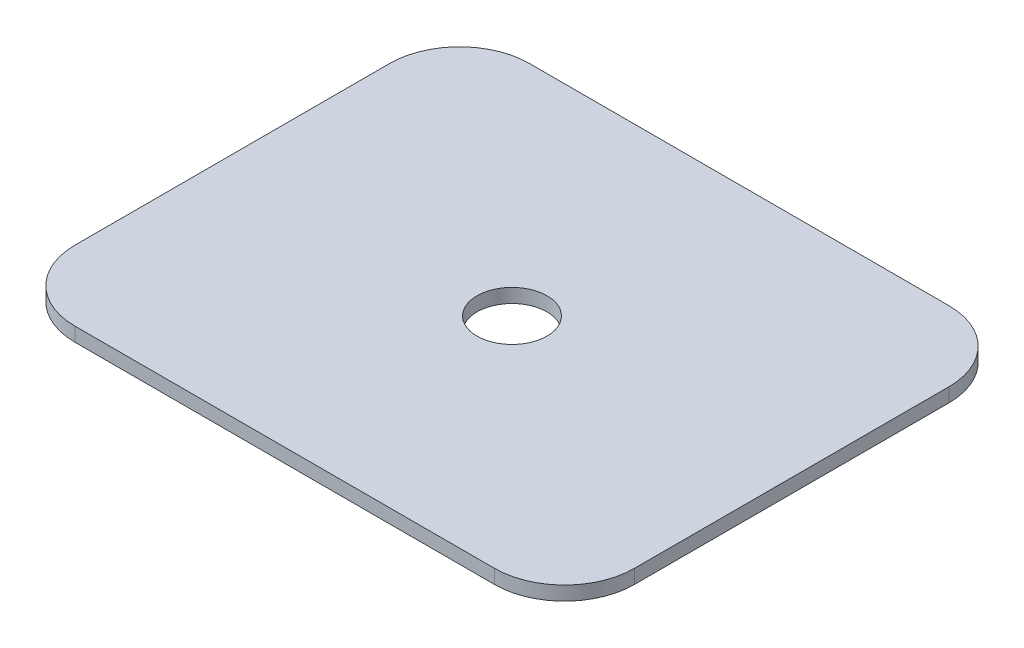
ISO-10303-21;
HEADER;
FILE_DESCRIPTION(('STEP AP214'),'2;1');
FILE_NAME('part.step','',(''),(''),'','','');
FILE_SCHEMA(('AUTOMOTIVE_DESIGN { 1 0 10303 214 1 1 1 1 }'));
ENDSEC;
DATA;
#1=APPLICATION_CONTEXT('core data for automotive mechanical design processes');
#2=APPLICATION_PROTOCOL_DEFINITION('international standard','automotive_design',2000,#1);
#3=PRODUCT_CONTEXT('',#1,'mechanical');
#4=PRODUCT('Part','Part','',(#3));
#5=PRODUCT_RELATED_PRODUCT_CATEGORY('part','',(#4));
#6=PRODUCT_DEFINITION_FORMATION('','',#4);
#7=PRODUCT_DEFINITION_CONTEXT('part definition',#1,'design');
#8=PRODUCT_DEFINITION('design','',#6,#7);
#9=PRODUCT_DEFINITION_SHAPE('','',#8);
#10=(LENGTH_UNIT() NAMED_UNIT(*) SI_UNIT(.MILLI.,.METRE.));
#11=(NAMED_UNIT(*) PLANE_ANGLE_UNIT() SI_UNIT($,.RADIAN.));
#12=(NAMED_UNIT(*) SI_UNIT($,.STERADIAN.) SOLID_ANGLE_UNIT());
#13=UNCERTAINTY_MEASURE_WITH_UNIT(LENGTH_MEASURE(1.E-05),#10,'distance_accuracy_value','');
#14=(GEOMETRIC_REPRESENTATION_CONTEXT(3) GLOBAL_UNCERTAINTY_ASSIGNED_CONTEXT((#13)) GLOBAL_UNIT_ASSIGNED_CONTEXT((#10,
#11,#12)) REPRESENTATION_CONTEXT('',''));
#15=CARTESIAN_POINT('',(0.,0.,0.));
#16=DIRECTION('',(0.,0.,1.));
#17=DIRECTION('',(1.,0.,0.));
#18=AXIS2_PLACEMENT_3D('',#15,#16,#17);
#19=CARTESIAN_POINT('',(-30.,2.,7.99999999999998));
#20=DIRECTION('',(0.,1.,0.));
#21=DIRECTION('',(0.,0.,1.));
#22=AXIS2_PLACEMENT_3D('',#19,#20,#21);
#23=PLANE('',#22);
#24=CARTESIAN_POINT('',(-30.,2.,7.99999999999998));
#25=DIRECTION('',(0.,1.,0.));
#26=DIRECTION('',(0.,0.,1.));
#27=AXIS2_PLACEMENT_3D('',#24,#25,#26);
#28=CIRCLE('',#27,10.);
#29=CARTESIAN_POINT('',(-30.,2.,-2.00000000000002));
#30=VERTEX_POINT('',#29);
#31=CARTESIAN_POINT('',(-40.,2.,8.00000000000006));
#32=VERTEX_POINT('',#31);
#33=EDGE_CURVE('E143',#30,#32,#28,.T.);
#34=ORIENTED_EDGE('',*,*,#33,.T.);
#35=DIRECTION('',(0.,0.,1.));
#36=VECTOR('',#35,1.);
#37=CARTESIAN_POINT('',(-40.,2.,8.00000000000006));
#38=LINE('',#37,#36);
#39=CARTESIAN_POINT('',(-40.,2.,52.9999999999999));
#40=VERTEX_POINT('',#39);
#41=EDGE_CURVE('E91',#32,#40,#38,.T.);
#42=ORIENTED_EDGE('',*,*,#41,.T.);
#43=CARTESIAN_POINT('',(-30.,2.,53.));
#44=DIRECTION('',(0.,1.,0.));
#45=DIRECTION('',(0.,0.,1.));
#46=AXIS2_PLACEMENT_3D('',#43,#44,#45);
#47=CIRCLE('',#46,10.);
#48=CARTESIAN_POINT('',(-30.,2.,63.));
#49=VERTEX_POINT('',#48);
#50=EDGE_CURVE('E158',#40,#49,#47,.T.);
#51=ORIENTED_EDGE('',*,*,#50,.T.);
#52=DIRECTION('',(1.,0.,0.));
#53=VECTOR('',#52,1.);
#54=CARTESIAN_POINT('',(-30.,2.,63.));
#55=LINE('',#54,#53);
#56=CARTESIAN_POINT('',(30.,2.,63.));
#57=VERTEX_POINT('',#56);
#58=EDGE_CURVE('E171',#49,#57,#55,.T.);
#59=ORIENTED_EDGE('',*,*,#58,.T.);
#60=CARTESIAN_POINT('',(30.,2.,53.));
#61=DIRECTION('',(0.,1.,0.));
#62=DIRECTION('',(0.,0.,1.));
#63=AXIS2_PLACEMENT_3D('',#60,#61,#62);
#64=CIRCLE('',#63,10.);
#65=CARTESIAN_POINT('',(40.,2.,52.9999999999999));
#66=VERTEX_POINT('',#65);
#67=EDGE_CURVE('E110',#57,#66,#64,.T.);
#68=ORIENTED_EDGE('',*,*,#67,.T.);
#69=DIRECTION('',(0.,0.,-1.));
#70=VECTOR('',#69,1.);
#71=CARTESIAN_POINT('',(40.,2.,8.00000000000006));
#72=LINE('',#71,#70);
#73=CARTESIAN_POINT('',(40.,2.,8.00000000000006));
#74=VERTEX_POINT('',#73);
#75=EDGE_CURVE('E104',#66,#74,#72,.T.);
#76=ORIENTED_EDGE('',*,*,#75,.T.);
#77=CARTESIAN_POINT('',(30.,2.,7.99999999999998));
#78=DIRECTION('',(0.,1.,0.));
#79=DIRECTION('',(0.,0.,1.));
#80=AXIS2_PLACEMENT_3D('',#77,#78,#79);
#81=CIRCLE('',#80,10.);
#82=CARTESIAN_POINT('',(30.,2.,-2.00000000000002));
#83=VERTEX_POINT('',#82);
#84=EDGE_CURVE('E108',#74,#83,#81,.T.);
#85=ORIENTED_EDGE('',*,*,#84,.T.);
#86=DIRECTION('',(-1.,0.,0.));
#87=VECTOR('',#86,1.);
#88=CARTESIAN_POINT('',(-30.,2.,-2.00000000000002));
#89=LINE('',#88,#87);
#90=EDGE_CURVE('E48',#83,#30,#89,.T.);
#91=ORIENTED_EDGE('',*,*,#90,.T.);
#92=EDGE_LOOP('',(#34,#42,#51,#59,#68,#76,#85,#91));
#93=FACE_BOUND('',#92,.T.);
#94=CARTESIAN_POINT('',(0.,2.,30.5));
#95=DIRECTION('',(0.,1.,0.));
#96=DIRECTION('',(0.,0.,1.));
#97=AXIS2_PLACEMENT_3D('',#94,#95,#96);
#98=CIRCLE('',#97,5.);
#99=CARTESIAN_POINT('',(0.,2.,35.5));
#100=VERTEX_POINT('',#99);
#101=EDGE_CURVE('E132',#100,#100,#98,.T.);
#102=ORIENTED_EDGE('',*,*,#101,.F.);
#103=EDGE_LOOP('',(#102));
#104=FACE_BOUND('',#103,.T.);
#105=ADVANCED_FACE('F31',(#93,#104),#23,.T.);
#106=CARTESIAN_POINT('',(-30.,0.,7.99999999999998));
#107=DIRECTION('',(0.,1.,0.));
#108=DIRECTION('',(0.,0.,1.));
#109=AXIS2_PLACEMENT_3D('',#106,#107,#108);
#110=PLANE('',#109);
#111=CARTESIAN_POINT('',(-30.,0.,7.99999999999998));
#112=DIRECTION('',(0.,1.,0.));
#113=DIRECTION('',(0.,0.,1.));
#114=AXIS2_PLACEMENT_3D('',#111,#112,#113);
#115=CIRCLE('',#114,10.);
#116=CARTESIAN_POINT('',(-30.,0.,-2.00000000000002));
#117=VERTEX_POINT('',#116);
#118=CARTESIAN_POINT('',(-40.,0.,8.00000000000006));
#119=VERTEX_POINT('',#118);
#120=EDGE_CURVE('E128',#117,#119,#115,.T.);
#121=ORIENTED_EDGE('',*,*,#120,.F.);
#122=DIRECTION('',(-1.,0.,0.));
#123=VECTOR('',#122,1.);
#124=CARTESIAN_POINT('',(-30.,0.,-2.00000000000002));
#125=LINE('',#124,#123);
#126=CARTESIAN_POINT('',(30.,0.,-2.00000000000002));
#127=VERTEX_POINT('',#126);
#128=EDGE_CURVE('E83',#127,#117,#125,.T.);
#129=ORIENTED_EDGE('',*,*,#128,.F.);
#130=CARTESIAN_POINT('',(30.,0.,7.99999999999998));
#131=DIRECTION('',(0.,1.,0.));
#132=DIRECTION('',(0.,0.,1.));
#133=AXIS2_PLACEMENT_3D('',#130,#131,#132);
#134=CIRCLE('',#133,10.);
#135=CARTESIAN_POINT('',(40.,0.,8.00000000000006));
#136=VERTEX_POINT('',#135);
#137=EDGE_CURVE('E77',#136,#127,#134,.T.);
#138=ORIENTED_EDGE('',*,*,#137,.F.);
#139=DIRECTION('',(0.,0.,-1.));
#140=VECTOR('',#139,1.);
#141=CARTESIAN_POINT('',(40.,0.,8.00000000000006));
#142=LINE('',#141,#140);
#143=CARTESIAN_POINT('',(40.,0.,52.9999999999999));
#144=VERTEX_POINT('',#143);
#145=EDGE_CURVE('E118',#144,#136,#142,.T.);
#146=ORIENTED_EDGE('',*,*,#145,.F.);
#147=CARTESIAN_POINT('',(30.,0.,53.));
#148=DIRECTION('',(0.,1.,0.));
#149=DIRECTION('',(0.,0.,1.));
#150=AXIS2_PLACEMENT_3D('',#147,#148,#149);
#151=CIRCLE('',#150,10.);
#152=CARTESIAN_POINT('',(30.,0.,63.));
#153=VERTEX_POINT('',#152);
#154=EDGE_CURVE('E138',#153,#144,#151,.T.);
#155=ORIENTED_EDGE('',*,*,#154,.F.);
#156=DIRECTION('',(1.,0.,0.));
#157=VECTOR('',#156,1.);
#158=CARTESIAN_POINT('',(-30.,0.,63.));
#159=LINE('',#158,#157);
#160=CARTESIAN_POINT('',(-30.,0.,63.));
#161=VERTEX_POINT('',#160);
#162=EDGE_CURVE('E136',#161,#153,#159,.T.);
#163=ORIENTED_EDGE('',*,*,#162,.F.);
#164=CARTESIAN_POINT('',(-30.,0.,53.));
#165=DIRECTION('',(0.,1.,0.));
#166=DIRECTION('',(0.,0.,1.));
#167=AXIS2_PLACEMENT_3D('',#164,#165,#166);
#168=CIRCLE('',#167,10.);
#169=CARTESIAN_POINT('',(-40.,0.,52.9999999999999));
#170=VERTEX_POINT('',#169);
#171=EDGE_CURVE('E134',#170,#161,#168,.T.);
#172=ORIENTED_EDGE('',*,*,#171,.F.);
#173=DIRECTION('',(0.,0.,1.));
#174=VECTOR('',#173,1.);
#175=CARTESIAN_POINT('',(-40.,0.,8.00000000000006));
#176=LINE('',#175,#174);
#177=EDGE_CURVE('E131',#119,#170,#176,.T.);
#178=ORIENTED_EDGE('',*,*,#177,.F.);
#179=EDGE_LOOP('',(#121,#129,#138,#146,#155,#163,#172,#178));
#180=FACE_BOUND('',#179,.T.);
#181=CARTESIAN_POINT('',(0.,0.,30.5));
#182=DIRECTION('',(0.,1.,0.));
#183=DIRECTION('',(0.,0.,1.));
#184=AXIS2_PLACEMENT_3D('',#181,#182,#183);
#185=CIRCLE('',#184,5.);
#186=CARTESIAN_POINT('',(0.,0.,35.5));
#187=VERTEX_POINT('',#186);
#188=EDGE_CURVE('E177',#187,#187,#185,.T.);
#189=ORIENTED_EDGE('',*,*,#188,.T.);
#190=EDGE_LOOP('',(#189));
#191=FACE_BOUND('',#190,.T.);
#192=ADVANCED_FACE('F162',(#180,#191),#110,.F.);
#193=CARTESIAN_POINT('',(-30.,2.,7.99999999999998));
#194=DIRECTION('',(0.,-1.,0.));
#195=DIRECTION('',(0.,0.,-1.));
#196=AXIS2_PLACEMENT_3D('',#193,#194,#195);
#197=CYLINDRICAL_SURFACE('',#196,10.);
#198=ORIENTED_EDGE('',*,*,#120,.T.);
#199=DIRECTION('',(0.,-1.,0.));
#200=VECTOR('',#199,1.);
#201=CARTESIAN_POINT('',(-40.,2.,8.00000000000006));
#202=LINE('',#201,#200);
#203=EDGE_CURVE('E11',#32,#119,#202,.T.);
#204=ORIENTED_EDGE('',*,*,#203,.F.);
#205=ORIENTED_EDGE('',*,*,#33,.F.);
#206=DIRECTION('',(0.,-1.,0.));
#207=VECTOR('',#206,1.);
#208=CARTESIAN_POINT('',(-30.,2.,-2.00000000000002));
#209=LINE('',#208,#207);
#210=EDGE_CURVE('E124',#30,#117,#209,.T.);
#211=ORIENTED_EDGE('',*,*,#210,.T.);
#212=EDGE_LOOP('',(#198,#204,#205,#211));
#213=FACE_BOUND('',#212,.T.);
#214=ADVANCED_FACE('F33',(#213),#197,.T.);
#215=CARTESIAN_POINT('',(-40.,2.,8.00000000000006));
#216=DIRECTION('',(1.,0.,0.));
#217=DIRECTION('',(0.,0.,-1.));
#218=AXIS2_PLACEMENT_3D('',#215,#216,#217);
#219=PLANE('',#218);
#220=ORIENTED_EDGE('',*,*,#177,.T.);
#221=DIRECTION('',(0.,-1.,0.));
#222=VECTOR('',#221,1.);
#223=CARTESIAN_POINT('',(-40.,2.,52.9999999999999));
#224=LINE('',#223,#222);
#225=EDGE_CURVE('E40',#40,#170,#224,.T.);
#226=ORIENTED_EDGE('',*,*,#225,.F.);
#227=ORIENTED_EDGE('',*,*,#41,.F.);
#228=ORIENTED_EDGE('',*,*,#203,.T.);
#229=EDGE_LOOP('',(#220,#226,#227,#228));
#230=FACE_BOUND('',#229,.T.);
#231=ADVANCED_FACE('F205',(#230),#219,.F.);
#232=CARTESIAN_POINT('',(-30.,2.,53.));
#233=DIRECTION('',(0.,-1.,0.));
#234=DIRECTION('',(0.,0.,-1.));
#235=AXIS2_PLACEMENT_3D('',#232,#233,#234);
#236=CYLINDRICAL_SURFACE('',#235,10.);
#237=ORIENTED_EDGE('',*,*,#171,.T.);
#238=DIRECTION('',(0.,-1.,0.));
#239=VECTOR('',#238,1.);
#240=CARTESIAN_POINT('',(-30.,2.,63.));
#241=LINE('',#240,#239);
#242=EDGE_CURVE('E150',#49,#161,#241,.T.);
#243=ORIENTED_EDGE('',*,*,#242,.F.);
#244=ORIENTED_EDGE('',*,*,#50,.F.);
#245=ORIENTED_EDGE('',*,*,#225,.T.);
#246=EDGE_LOOP('',(#237,#243,#244,#245));
#247=FACE_BOUND('',#246,.T.);
#248=ADVANCED_FACE('F156',(#247),#236,.T.);
#249=CARTESIAN_POINT('',(-30.,2.,63.));
#250=DIRECTION('',(0.,0.,-1.));
#251=DIRECTION('',(-1.,0.,0.));
#252=AXIS2_PLACEMENT_3D('',#249,#250,#251);
#253=PLANE('',#252);
#254=ORIENTED_EDGE('',*,*,#162,.T.);
#255=DIRECTION('',(0.,-1.,0.));
#256=VECTOR('',#255,1.);
#257=CARTESIAN_POINT('',(30.,2.,63.));
#258=LINE('',#257,#256);
#259=EDGE_CURVE('E147',#57,#153,#258,.T.);
#260=ORIENTED_EDGE('',*,*,#259,.F.);
#261=ORIENTED_EDGE('',*,*,#58,.F.);
#262=ORIENTED_EDGE('',*,*,#242,.T.);
#263=EDGE_LOOP('',(#254,#260,#261,#262));
#264=FACE_BOUND('',#263,.T.);
#265=ADVANCED_FACE('F167',(#264),#253,.F.);
#266=CARTESIAN_POINT('',(30.,2.,53.));
#267=DIRECTION('',(0.,-1.,0.));
#268=DIRECTION('',(0.,0.,-1.));
#269=AXIS2_PLACEMENT_3D('',#266,#267,#268);
#270=CYLINDRICAL_SURFACE('',#269,10.);
#271=ORIENTED_EDGE('',*,*,#154,.T.);
#272=DIRECTION('',(0.,-1.,0.));
#273=VECTOR('',#272,1.);
#274=CARTESIAN_POINT('',(40.,2.,52.9999999999999));
#275=LINE('',#274,#273);
#276=EDGE_CURVE('E119',#66,#144,#275,.T.);
#277=ORIENTED_EDGE('',*,*,#276,.F.);
#278=ORIENTED_EDGE('',*,*,#67,.F.);
#279=ORIENTED_EDGE('',*,*,#259,.T.);
#280=EDGE_LOOP('',(#271,#277,#278,#279));
#281=FACE_BOUND('',#280,.T.);
#282=ADVANCED_FACE('F170',(#281),#270,.T.);
#283=CARTESIAN_POINT('',(40.,2.,8.00000000000006));
#284=DIRECTION('',(-1.,0.,0.));
#285=DIRECTION('',(0.,0.,1.));
#286=AXIS2_PLACEMENT_3D('',#283,#284,#285);
#287=PLANE('',#286);
#288=ORIENTED_EDGE('',*,*,#145,.T.);
#289=DIRECTION('',(0.,-1.,0.));
#290=VECTOR('',#289,1.);
#291=CARTESIAN_POINT('',(40.,2.,8.00000000000006));
#292=LINE('',#291,#290);
#293=EDGE_CURVE('E115',#74,#136,#292,.T.);
#294=ORIENTED_EDGE('',*,*,#293,.F.);
#295=ORIENTED_EDGE('',*,*,#75,.F.);
#296=ORIENTED_EDGE('',*,*,#276,.T.);
#297=EDGE_LOOP('',(#288,#294,#295,#296));
#298=FACE_BOUND('',#297,.T.);
#299=ADVANCED_FACE('F116',(#298),#287,.F.);
#300=CARTESIAN_POINT('',(30.,2.,7.99999999999998));
#301=DIRECTION('',(0.,-1.,0.));
#302=DIRECTION('',(0.,0.,-1.));
#303=AXIS2_PLACEMENT_3D('',#300,#301,#302);
#304=CYLINDRICAL_SURFACE('',#303,10.);
#305=ORIENTED_EDGE('',*,*,#137,.T.);
#306=DIRECTION('',(0.,-1.,0.));
#307=VECTOR('',#306,1.);
#308=CARTESIAN_POINT('',(30.,2.,-2.00000000000002));
#309=LINE('',#308,#307);
#310=EDGE_CURVE('E120',#83,#127,#309,.T.);
#311=ORIENTED_EDGE('',*,*,#310,.F.);
#312=ORIENTED_EDGE('',*,*,#84,.F.);
#313=ORIENTED_EDGE('',*,*,#293,.T.);
#314=EDGE_LOOP('',(#305,#311,#312,#313));
#315=FACE_BOUND('',#314,.T.);
#316=ADVANCED_FACE('F122',(#315),#304,.T.);
#317=CARTESIAN_POINT('',(-30.,2.,-2.00000000000002));
#318=DIRECTION('',(0.,0.,1.));
#319=DIRECTION('',(1.,0.,0.));
#320=AXIS2_PLACEMENT_3D('',#317,#318,#319);
#321=PLANE('',#320);
#322=ORIENTED_EDGE('',*,*,#128,.T.);
#323=ORIENTED_EDGE('',*,*,#210,.F.);
#324=ORIENTED_EDGE('',*,*,#90,.F.);
#325=ORIENTED_EDGE('',*,*,#310,.T.);
#326=EDGE_LOOP('',(#322,#323,#324,#325));
#327=FACE_BOUND('',#326,.T.);
#328=ADVANCED_FACE('F193',(#327),#321,.F.);
#329=CARTESIAN_POINT('',(0.,2.,30.5));
#330=DIRECTION('',(0.,-1.,0.));
#331=DIRECTION('',(0.,0.,-1.));
#332=AXIS2_PLACEMENT_3D('',#329,#330,#331);
#333=CYLINDRICAL_SURFACE('',#332,5.);
#334=ORIENTED_EDGE('',*,*,#101,.T.);
#335=EDGE_LOOP('',(#334));
#336=FACE_BOUND('',#335,.T.);
#337=ORIENTED_EDGE('',*,*,#188,.F.);
#338=EDGE_LOOP('',(#337));
#339=FACE_BOUND('',#338,.T.);
#340=ADVANCED_FACE('F183',(#336,#339),#333,.F.);
#341=CLOSED_SHELL('',(#105,#192,#214,#231,#248,#265,#282,#299,#316,#328,#340));
#342=MANIFOLD_SOLID_BREP('B2',#341);
#343=ADVANCED_BREP_SHAPE_REPRESENTATION('',(#18,#342),#14);
#344=SHAPE_DEFINITION_REPRESENTATION(#9,#343);
ENDSEC;
END-ISO-10303-21;
